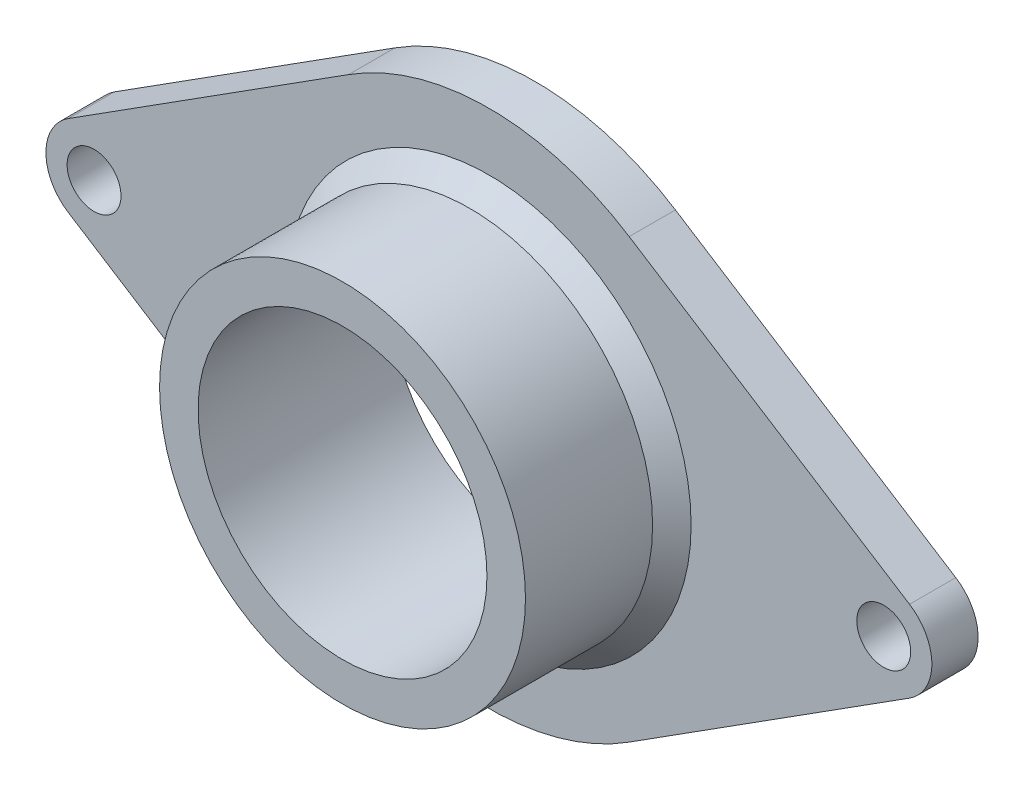
ISO-10303-21;
HEADER;
FILE_DESCRIPTION(('STEP AP214'),'2;1');
FILE_NAME('part.step','',(''),(''),'','','');
FILE_SCHEMA(('AUTOMOTIVE_DESIGN { 1 0 10303 214 1 1 1 1 }'));
ENDSEC;
DATA;
#1=APPLICATION_CONTEXT('core data for automotive mechanical design processes');
#2=APPLICATION_PROTOCOL_DEFINITION('international standard','automotive_design',2000,#1);
#3=PRODUCT_CONTEXT('',#1,'mechanical');
#4=PRODUCT('Part','Part','',(#3));
#5=PRODUCT_RELATED_PRODUCT_CATEGORY('part','',(#4));
#6=PRODUCT_DEFINITION_FORMATION('','',#4);
#7=PRODUCT_DEFINITION_CONTEXT('part definition',#1,'design');
#8=PRODUCT_DEFINITION('design','',#6,#7);
#9=PRODUCT_DEFINITION_SHAPE('','',#8);
#10=(LENGTH_UNIT() NAMED_UNIT(*) SI_UNIT(.MILLI.,.METRE.));
#11=(NAMED_UNIT(*) PLANE_ANGLE_UNIT() SI_UNIT($,.RADIAN.));
#12=(NAMED_UNIT(*) SI_UNIT($,.STERADIAN.) SOLID_ANGLE_UNIT());
#13=UNCERTAINTY_MEASURE_WITH_UNIT(LENGTH_MEASURE(1.E-05),#10,'distance_accuracy_value','');
#14=(GEOMETRIC_REPRESENTATION_CONTEXT(3) GLOBAL_UNCERTAINTY_ASSIGNED_CONTEXT((#13)) GLOBAL_UNIT_ASSIGNED_CONTEXT((#10,
#11,#12)) REPRESENTATION_CONTEXT('',''));
#15=CARTESIAN_POINT('',(0.,0.,0.));
#16=DIRECTION('',(0.,0.,1.));
#17=DIRECTION('',(1.,0.,0.));
#18=AXIS2_PLACEMENT_3D('',#15,#16,#17);
#19=CARTESIAN_POINT('',(0.,0.,50.));
#20=DIRECTION('',(0.,0.,-1.));
#21=DIRECTION('',(-1.,0.,0.));
#22=AXIS2_PLACEMENT_3D('',#19,#20,#21);
#23=CYLINDRICAL_SURFACE('',#22,47.5);
#24=CARTESIAN_POINT('',(0.,0.,17.));
#25=DIRECTION('',(0.,0.,-1.));
#26=DIRECTION('',(-1.,0.,0.));
#27=AXIS2_PLACEMENT_3D('',#24,#25,#26);
#28=CIRCLE('',#27,47.5);
#29=CARTESIAN_POINT('',(-47.5,0.,17.));
#30=VERTEX_POINT('',#29);
#31=EDGE_CURVE('E11',#30,#30,#28,.F.);
#32=ORIENTED_EDGE('',*,*,#31,.T.);
#33=EDGE_LOOP('',(#32));
#34=FACE_BOUND('',#33,.T.);
#35=CARTESIAN_POINT('',(0.,0.,50.));
#36=DIRECTION('',(0.,0.,1.));
#37=DIRECTION('',(1.,0.,0.));
#38=AXIS2_PLACEMENT_3D('',#35,#36,#37);
#39=CIRCLE('',#38,47.5);
#40=CARTESIAN_POINT('',(47.5,0.,50.));
#41=VERTEX_POINT('',#40);
#42=EDGE_CURVE('E170',#41,#41,#39,.T.);
#43=ORIENTED_EDGE('',*,*,#42,.F.);
#44=EDGE_LOOP('',(#43));
#45=FACE_BOUND('',#44,.T.);
#46=ADVANCED_FACE('F33',(#34,#45),#23,.T.);
#47=CARTESIAN_POINT('',(0.,0.,50.));
#48=DIRECTION('',(0.,0.,1.));
#49=DIRECTION('',(1.,0.,0.));
#50=AXIS2_PLACEMENT_3D('',#47,#48,#49);
#51=PLANE('',#50);
#52=ORIENTED_EDGE('',*,*,#42,.T.);
#53=EDGE_LOOP('',(#52));
#54=FACE_BOUND('',#53,.T.);
#55=CARTESIAN_POINT('',(0.,0.,50.));
#56=DIRECTION('',(0.,0.,1.));
#57=DIRECTION('',(1.,0.,0.));
#58=AXIS2_PLACEMENT_3D('',#55,#56,#57);
#59=CIRCLE('',#58,37.5);
#60=CARTESIAN_POINT('',(37.5,0.,50.));
#61=VERTEX_POINT('',#60);
#62=EDGE_CURVE('E167',#61,#61,#59,.T.);
#63=ORIENTED_EDGE('',*,*,#62,.F.);
#64=EDGE_LOOP('',(#63));
#65=FACE_BOUND('',#64,.T.);
#66=ADVANCED_FACE('F197',(#54,#65),#51,.T.);
#67=CARTESIAN_POINT('',(0.,0.,0.));
#68=DIRECTION('',(0.,0.,1.));
#69=DIRECTION('',(1.,0.,0.));
#70=AXIS2_PLACEMENT_3D('',#67,#68,#69);
#71=PLANE('',#70);
#72=CARTESIAN_POINT('',(-102.500000000016,2.47857290247566E-11,0.));
#73=DIRECTION('',(0.,0.,1.));
#74=DIRECTION('',(1.,0.,0.));
#75=AXIS2_PLACEMENT_3D('',#72,#73,#74);
#76=CIRCLE('',#75,7.);
#77=CARTESIAN_POINT('',(-95.5000000000158,2.47857290247566E-11,0.));
#78=VERTEX_POINT('',#77);
#79=EDGE_CURVE('E137',#78,#78,#76,.T.);
#80=ORIENTED_EDGE('',*,*,#79,.T.);
#81=EDGE_LOOP('',(#80));
#82=FACE_BOUND('',#81,.T.);
#83=CARTESIAN_POINT('',(102.500000000016,-2.47718512369488E-11,0.));
#84=DIRECTION('',(0.,0.,1.));
#85=DIRECTION('',(1.,0.,0.));
#86=AXIS2_PLACEMENT_3D('',#83,#84,#85);
#87=CIRCLE('',#86,7.);
#88=CARTESIAN_POINT('',(109.500000000016,-2.47718512369488E-11,0.));
#89=VERTEX_POINT('',#88);
#90=EDGE_CURVE('E178',#89,#89,#87,.T.);
#91=ORIENTED_EDGE('',*,*,#90,.T.);
#92=EDGE_LOOP('',(#91));
#93=FACE_BOUND('',#92,.T.);
#94=CARTESIAN_POINT('',(0.,0.,0.));
#95=DIRECTION('',(0.,0.,1.));
#96=DIRECTION('',(1.,0.,0.));
#97=AXIS2_PLACEMENT_3D('',#94,#95,#96);
#98=CIRCLE('',#97,37.5);
#99=CARTESIAN_POINT('',(37.5,0.,0.));
#100=VERTEX_POINT('',#99);
#101=EDGE_CURVE('E157',#100,#100,#98,.T.);
#102=ORIENTED_EDGE('',*,*,#101,.T.);
#103=EDGE_LOOP('',(#102));
#104=FACE_BOUND('',#103,.T.);
#105=CARTESIAN_POINT('',(0.,0.,0.));
#106=DIRECTION('',(0.,0.,-1.));
#107=DIRECTION('',(-1.,0.,0.));
#108=AXIS2_PLACEMENT_3D('',#105,#106,#107);
#109=CIRCLE('',#108,67.5);
#110=CARTESIAN_POINT('',(36.4250879518292,-56.8283641124879,0.));
#111=VERTEX_POINT('',#110);
#112=CARTESIAN_POINT('',(-36.4250879518293,-56.8283641124879,0.));
#113=VERTEX_POINT('',#112);
#114=EDGE_CURVE('E133',#111,#113,#109,.T.);
#115=ORIENTED_EDGE('',*,*,#114,.T.);
#116=DIRECTION('',(-0.843848784833768,0.536581054766727,0.));
#117=VECTOR('',#116,1.);
#118=CARTESIAN_POINT('',(-36.4250879518293,-56.8283641124879,0.));
#119=LINE('',#118,#117);
#120=CARTESIAN_POINT('',(-109.207263184572,-10.5481098104148,0.));
#121=VERTEX_POINT('',#120);
#122=EDGE_CURVE('E136',#113,#121,#119,.T.);
#123=ORIENTED_EDGE('',*,*,#122,.T.);
#124=CARTESIAN_POINT('',(-102.500000000016,2.47857290247566E-11,0.));
#125=DIRECTION('',(0.,0.,-1.));
#126=DIRECTION('',(-1.,0.,0.));
#127=AXIS2_PLACEMENT_3D('',#124,#125,#126);
#128=CIRCLE('',#127,12.5);
#129=CARTESIAN_POINT('',(-109.207263184595,10.5481098104501,0.));
#130=VERTEX_POINT('',#129);
#131=EDGE_CURVE('E140',#121,#130,#128,.T.);
#132=ORIENTED_EDGE('',*,*,#131,.T.);
#133=DIRECTION('',(0.843848784834028,0.536581054766318,0.));
#134=VECTOR('',#133,1.);
#135=CARTESIAN_POINT('',(-36.4250879518292,56.828364112488,0.));
#136=LINE('',#135,#134);
#137=CARTESIAN_POINT('',(-36.4250879518292,56.828364112488,0.));
#138=VERTEX_POINT('',#137);
#139=EDGE_CURVE('E143',#130,#138,#136,.T.);
#140=ORIENTED_EDGE('',*,*,#139,.T.);
#141=CARTESIAN_POINT('',(0.,0.,0.));
#142=DIRECTION('',(0.,0.,-1.));
#143=DIRECTION('',(-1.,0.,0.));
#144=AXIS2_PLACEMENT_3D('',#141,#142,#143);
#145=CIRCLE('',#144,67.5);
#146=CARTESIAN_POINT('',(36.4250879518517,56.8283641124735,0.));
#147=VERTEX_POINT('',#146);
#148=EDGE_CURVE('E146',#138,#147,#145,.T.);
#149=ORIENTED_EDGE('',*,*,#148,.T.);
#150=DIRECTION('',(0.843848784833768,-0.536581054766727,0.));
#151=VECTOR('',#150,1.);
#152=CARTESIAN_POINT('',(36.4250879518517,56.8283641124735,0.));
#153=LINE('',#152,#151);
#154=CARTESIAN_POINT('',(109.207263184595,10.5481098104005,0.));
#155=VERTEX_POINT('',#154);
#156=EDGE_CURVE('E149',#147,#155,#153,.T.);
#157=ORIENTED_EDGE('',*,*,#156,.T.);
#158=CARTESIAN_POINT('',(102.500000000016,-2.47718512369488E-11,0.));
#159=DIRECTION('',(0.,0.,-1.));
#160=DIRECTION('',(-1.,0.,0.));
#161=AXIS2_PLACEMENT_3D('',#158,#159,#160);
#162=CIRCLE('',#161,12.5);
#163=CARTESIAN_POINT('',(109.207263184595,-10.5481098104501,0.));
#164=VERTEX_POINT('',#163);
#165=EDGE_CURVE('E110',#155,#164,#162,.T.);
#166=ORIENTED_EDGE('',*,*,#165,.T.);
#167=DIRECTION('',(-0.843848784834027,-0.536581054766319,0.));
#168=VECTOR('',#167,1.);
#169=CARTESIAN_POINT('',(36.4250879518292,-56.8283641124879,0.));
#170=LINE('',#169,#168);
#171=EDGE_CURVE('E152',#164,#111,#170,.T.);
#172=ORIENTED_EDGE('',*,*,#171,.T.);
#173=EDGE_LOOP('',(#115,#123,#132,#140,#149,#157,#166,#172));
#174=FACE_BOUND('',#173,.T.);
#175=ADVANCED_FACE('F204',(#82,#93,#104,#174),#71,.F.);
#176=CARTESIAN_POINT('',(0.,0.,50.));
#177=DIRECTION('',(0.,0.,-1.));
#178=DIRECTION('',(-1.,0.,0.));
#179=AXIS2_PLACEMENT_3D('',#176,#177,#178);
#180=CYLINDRICAL_SURFACE('',#179,37.5);
#181=ORIENTED_EDGE('',*,*,#62,.T.);
#182=EDGE_LOOP('',(#181));
#183=FACE_BOUND('',#182,.T.);
#184=ORIENTED_EDGE('',*,*,#101,.F.);
#185=EDGE_LOOP('',(#184));
#186=FACE_BOUND('',#185,.T.);
#187=ADVANCED_FACE('F210',(#183,#186),#180,.F.);
#188=CARTESIAN_POINT('',(0.,0.,12.));
#189=DIRECTION('',(0.,0.,-1.));
#190=DIRECTION('',(-1.,0.,0.));
#191=AXIS2_PLACEMENT_3D('',#188,#189,#190);
#192=CYLINDRICAL_SURFACE('',#191,67.5);
#193=ORIENTED_EDGE('',*,*,#114,.F.);
#194=DIRECTION('',(0.,0.,-1.));
#195=VECTOR('',#194,1.);
#196=CARTESIAN_POINT('',(36.4250879518292,-56.8283641124879,12.));
#197=LINE('',#196,#195);
#198=CARTESIAN_POINT('',(36.4250879518292,-56.8283641124879,12.));
#199=VERTEX_POINT('',#198);
#200=EDGE_CURVE('E50',#199,#111,#197,.T.);
#201=ORIENTED_EDGE('',*,*,#200,.F.);
#202=CARTESIAN_POINT('',(0.,0.,12.));
#203=DIRECTION('',(0.,0.,-1.));
#204=DIRECTION('',(-1.,0.,0.));
#205=AXIS2_PLACEMENT_3D('',#202,#203,#204);
#206=CIRCLE('',#205,67.5);
#207=CARTESIAN_POINT('',(-36.4250879518293,-56.8283641124879,12.));
#208=VERTEX_POINT('',#207);
#209=EDGE_CURVE('E155',#199,#208,#206,.T.);
#210=ORIENTED_EDGE('',*,*,#209,.T.);
#211=DIRECTION('',(0.,0.,-1.));
#212=VECTOR('',#211,1.);
#213=CARTESIAN_POINT('',(-36.4250879518293,-56.8283641124879,12.));
#214=LINE('',#213,#212);
#215=EDGE_CURVE('E91',#208,#113,#214,.T.);
#216=ORIENTED_EDGE('',*,*,#215,.T.);
#217=EDGE_LOOP('',(#193,#201,#210,#216));
#218=FACE_BOUND('',#217,.T.);
#219=ADVANCED_FACE('F215',(#218),#192,.T.);
#220=CARTESIAN_POINT('',(36.4250879518292,-56.8283641124879,12.));
#221=DIRECTION('',(0.536581054766319,-0.843848784834027,0.));
#222=DIRECTION('',(0.843848784834028,0.536581054766319,0.));
#223=AXIS2_PLACEMENT_3D('',#220,#221,#222);
#224=PLANE('',#223);
#225=ORIENTED_EDGE('',*,*,#171,.F.);
#226=DIRECTION('',(0.,0.,-1.));
#227=VECTOR('',#226,1.);
#228=CARTESIAN_POINT('',(109.207263184595,-10.5481098104501,12.));
#229=LINE('',#228,#227);
#230=CARTESIAN_POINT('',(109.207263184595,-10.5481098104501,12.));
#231=VERTEX_POINT('',#230);
#232=EDGE_CURVE('E79',#231,#164,#229,.T.);
#233=ORIENTED_EDGE('',*,*,#232,.F.);
#234=DIRECTION('',(-0.843848784834027,-0.536581054766319,0.));
#235=VECTOR('',#234,1.);
#236=CARTESIAN_POINT('',(36.4250879518292,-56.8283641124879,12.));
#237=LINE('',#236,#235);
#238=EDGE_CURVE('E123',#231,#199,#237,.T.);
#239=ORIENTED_EDGE('',*,*,#238,.T.);
#240=ORIENTED_EDGE('',*,*,#200,.T.);
#241=EDGE_LOOP('',(#225,#233,#239,#240));
#242=FACE_BOUND('',#241,.T.);
#243=ADVANCED_FACE('F219',(#242),#224,.T.);
#244=CARTESIAN_POINT('',(102.500000000016,-2.47718512369488E-11,12.));
#245=DIRECTION('',(0.,0.,-1.));
#246=DIRECTION('',(-1.,0.,0.));
#247=AXIS2_PLACEMENT_3D('',#244,#245,#246);
#248=CYLINDRICAL_SURFACE('',#247,12.5);
#249=ORIENTED_EDGE('',*,*,#165,.F.);
#250=DIRECTION('',(0.,0.,-1.));
#251=VECTOR('',#250,1.);
#252=CARTESIAN_POINT('',(109.207263184595,10.5481098104005,12.));
#253=LINE('',#252,#251);
#254=CARTESIAN_POINT('',(109.207263184595,10.5481098104005,12.));
#255=VERTEX_POINT('',#254);
#256=EDGE_CURVE('E105',#255,#155,#253,.T.);
#257=ORIENTED_EDGE('',*,*,#256,.F.);
#258=CARTESIAN_POINT('',(102.500000000016,-2.47718512369488E-11,12.));
#259=DIRECTION('',(0.,0.,-1.));
#260=DIRECTION('',(-1.,0.,0.));
#261=AXIS2_PLACEMENT_3D('',#258,#259,#260);
#262=CIRCLE('',#261,12.5);
#263=EDGE_CURVE('E108',#255,#231,#262,.T.);
#264=ORIENTED_EDGE('',*,*,#263,.T.);
#265=ORIENTED_EDGE('',*,*,#232,.T.);
#266=EDGE_LOOP('',(#249,#257,#264,#265));
#267=FACE_BOUND('',#266,.T.);
#268=ADVANCED_FACE('F107',(#267),#248,.T.);
#269=CARTESIAN_POINT('',(36.4250879518517,56.8283641124735,12.));
#270=DIRECTION('',(0.536581054766727,0.843848784833768,0.));
#271=DIRECTION('',(-0.843848784833768,0.536581054766727,0.));
#272=AXIS2_PLACEMENT_3D('',#269,#270,#271);
#273=PLANE('',#272);
#274=ORIENTED_EDGE('',*,*,#156,.F.);
#275=DIRECTION('',(0.,0.,-1.));
#276=VECTOR('',#275,1.);
#277=CARTESIAN_POINT('',(36.4250879518517,56.8283641124735,12.));
#278=LINE('',#277,#276);
#279=CARTESIAN_POINT('',(36.4250879518517,56.8283641124735,12.));
#280=VERTEX_POINT('',#279);
#281=EDGE_CURVE('E115',#280,#147,#278,.T.);
#282=ORIENTED_EDGE('',*,*,#281,.F.);
#283=DIRECTION('',(0.843848784833768,-0.536581054766727,0.));
#284=VECTOR('',#283,1.);
#285=CARTESIAN_POINT('',(36.4250879518517,56.8283641124735,12.));
#286=LINE('',#285,#284);
#287=EDGE_CURVE('E121',#280,#255,#286,.T.);
#288=ORIENTED_EDGE('',*,*,#287,.T.);
#289=ORIENTED_EDGE('',*,*,#256,.T.);
#290=EDGE_LOOP('',(#274,#282,#288,#289));
#291=FACE_BOUND('',#290,.T.);
#292=ADVANCED_FACE('F125',(#291),#273,.T.);
#293=CARTESIAN_POINT('',(0.,0.,12.));
#294=DIRECTION('',(0.,0.,-1.));
#295=DIRECTION('',(-1.,0.,0.));
#296=AXIS2_PLACEMENT_3D('',#293,#294,#295);
#297=CYLINDRICAL_SURFACE('',#296,67.5);
#298=ORIENTED_EDGE('',*,*,#148,.F.);
#299=DIRECTION('',(0.,0.,-1.));
#300=VECTOR('',#299,1.);
#301=CARTESIAN_POINT('',(-36.4250879518292,56.828364112488,12.));
#302=LINE('',#301,#300);
#303=CARTESIAN_POINT('',(-36.4250879518292,56.828364112488,12.));
#304=VERTEX_POINT('',#303);
#305=EDGE_CURVE('E160',#304,#138,#302,.T.);
#306=ORIENTED_EDGE('',*,*,#305,.F.);
#307=CARTESIAN_POINT('',(0.,0.,12.));
#308=DIRECTION('',(0.,0.,-1.));
#309=DIRECTION('',(-1.,0.,0.));
#310=AXIS2_PLACEMENT_3D('',#307,#308,#309);
#311=CIRCLE('',#310,67.5);
#312=EDGE_CURVE('E126',#304,#280,#311,.T.);
#313=ORIENTED_EDGE('',*,*,#312,.T.);
#314=ORIENTED_EDGE('',*,*,#281,.T.);
#315=EDGE_LOOP('',(#298,#306,#313,#314));
#316=FACE_BOUND('',#315,.T.);
#317=ADVANCED_FACE('F230',(#316),#297,.T.);
#318=CARTESIAN_POINT('',(-36.4250879518292,56.828364112488,12.));
#319=DIRECTION('',(-0.536581054766318,0.843848784834028,0.));
#320=DIRECTION('',(-0.843848784834028,-0.536581054766319,0.));
#321=AXIS2_PLACEMENT_3D('',#318,#319,#320);
#322=PLANE('',#321);
#323=ORIENTED_EDGE('',*,*,#139,.F.);
#324=DIRECTION('',(0.,0.,-1.));
#325=VECTOR('',#324,1.);
#326=CARTESIAN_POINT('',(-109.207263184595,10.5481098104501,12.));
#327=LINE('',#326,#325);
#328=CARTESIAN_POINT('',(-109.207263184595,10.5481098104501,12.));
#329=VERTEX_POINT('',#328);
#330=EDGE_CURVE('E162',#329,#130,#327,.T.);
#331=ORIENTED_EDGE('',*,*,#330,.F.);
#332=DIRECTION('',(0.843848784834028,0.536581054766318,0.));
#333=VECTOR('',#332,1.);
#334=CARTESIAN_POINT('',(-36.4250879518292,56.828364112488,12.));
#335=LINE('',#334,#333);
#336=EDGE_CURVE('E128',#329,#304,#335,.T.);
#337=ORIENTED_EDGE('',*,*,#336,.T.);
#338=ORIENTED_EDGE('',*,*,#305,.T.);
#339=EDGE_LOOP('',(#323,#331,#337,#338));
#340=FACE_BOUND('',#339,.T.);
#341=ADVANCED_FACE('F226',(#340),#322,.T.);
#342=CARTESIAN_POINT('',(-102.500000000016,2.47857290247566E-11,12.));
#343=DIRECTION('',(0.,0.,-1.));
#344=DIRECTION('',(-1.,0.,0.));
#345=AXIS2_PLACEMENT_3D('',#342,#343,#344);
#346=CYLINDRICAL_SURFACE('',#345,12.5);
#347=ORIENTED_EDGE('',*,*,#131,.F.);
#348=DIRECTION('',(0.,0.,-1.));
#349=VECTOR('',#348,1.);
#350=CARTESIAN_POINT('',(-109.207263184572,-10.5481098104148,12.));
#351=LINE('',#350,#349);
#352=CARTESIAN_POINT('',(-109.207263184572,-10.5481098104148,12.));
#353=VERTEX_POINT('',#352);
#354=EDGE_CURVE('E164',#353,#121,#351,.T.);
#355=ORIENTED_EDGE('',*,*,#354,.F.);
#356=CARTESIAN_POINT('',(-102.500000000016,2.47857290247566E-11,12.));
#357=DIRECTION('',(0.,0.,-1.));
#358=DIRECTION('',(-1.,0.,0.));
#359=AXIS2_PLACEMENT_3D('',#356,#357,#358);
#360=CIRCLE('',#359,12.5);
#361=EDGE_CURVE('E259',#353,#329,#360,.T.);
#362=ORIENTED_EDGE('',*,*,#361,.T.);
#363=ORIENTED_EDGE('',*,*,#330,.T.);
#364=EDGE_LOOP('',(#347,#355,#362,#363));
#365=FACE_BOUND('',#364,.T.);
#366=ADVANCED_FACE('F223',(#365),#346,.T.);
#367=CARTESIAN_POINT('',(-36.4250879518293,-56.8283641124879,12.));
#368=DIRECTION('',(-0.536581054766727,-0.843848784833768,0.));
#369=DIRECTION('',(0.843848784833768,-0.536581054766727,0.));
#370=AXIS2_PLACEMENT_3D('',#367,#368,#369);
#371=PLANE('',#370);
#372=ORIENTED_EDGE('',*,*,#122,.F.);
#373=ORIENTED_EDGE('',*,*,#215,.F.);
#374=DIRECTION('',(-0.843848784833768,0.536581054766727,0.));
#375=VECTOR('',#374,1.);
#376=CARTESIAN_POINT('',(-36.4250879518293,-56.8283641124879,12.));
#377=LINE('',#376,#375);
#378=EDGE_CURVE('E257',#208,#353,#377,.T.);
#379=ORIENTED_EDGE('',*,*,#378,.T.);
#380=ORIENTED_EDGE('',*,*,#354,.T.);
#381=EDGE_LOOP('',(#372,#373,#379,#380));
#382=FACE_BOUND('',#381,.T.);
#383=ADVANCED_FACE('F220',(#382),#371,.T.);
#384=CARTESIAN_POINT('',(0.,0.,12.));
#385=DIRECTION('',(0.,0.,-1.));
#386=DIRECTION('',(-1.,0.,0.));
#387=AXIS2_PLACEMENT_3D('',#384,#385,#386);
#388=PLANE('',#387);
#389=CARTESIAN_POINT('',(0.,0.,12.));
#390=DIRECTION('',(0.,0.,-1.));
#391=DIRECTION('',(-1.,0.,0.));
#392=AXIS2_PLACEMENT_3D('',#389,#390,#391);
#393=CIRCLE('',#392,52.5000000000001);
#394=CARTESIAN_POINT('',(-52.5000000000001,0.,12.));
#395=VERTEX_POINT('',#394);
#396=EDGE_CURVE('E42',#395,#395,#393,.T.);
#397=ORIENTED_EDGE('',*,*,#396,.T.);
#398=EDGE_LOOP('',(#397));
#399=FACE_BOUND('',#398,.T.);
#400=CARTESIAN_POINT('',(-102.500000000016,2.47857290247566E-11,12.));
#401=DIRECTION('',(0.,0.,-1.));
#402=DIRECTION('',(-1.,0.,0.));
#403=AXIS2_PLACEMENT_3D('',#400,#401,#402);
#404=CIRCLE('',#403,7.);
#405=CARTESIAN_POINT('',(-109.500000000016,2.47857290247566E-11,12.));
#406=VERTEX_POINT('',#405);
#407=EDGE_CURVE('E179',#406,#406,#404,.T.);
#408=ORIENTED_EDGE('',*,*,#407,.T.);
#409=EDGE_LOOP('',(#408));
#410=FACE_BOUND('',#409,.T.);
#411=CARTESIAN_POINT('',(102.500000000016,-2.47718512369488E-11,12.));
#412=DIRECTION('',(0.,0.,-1.));
#413=DIRECTION('',(-1.,0.,0.));
#414=AXIS2_PLACEMENT_3D('',#411,#412,#413);
#415=CIRCLE('',#414,7.);
#416=CARTESIAN_POINT('',(95.5000000000158,-2.47718512369488E-11,12.));
#417=VERTEX_POINT('',#416);
#418=EDGE_CURVE('E175',#417,#417,#415,.T.);
#419=ORIENTED_EDGE('',*,*,#418,.T.);
#420=EDGE_LOOP('',(#419));
#421=FACE_BOUND('',#420,.T.);
#422=ORIENTED_EDGE('',*,*,#209,.F.);
#423=ORIENTED_EDGE('',*,*,#238,.F.);
#424=ORIENTED_EDGE('',*,*,#263,.F.);
#425=ORIENTED_EDGE('',*,*,#287,.F.);
#426=ORIENTED_EDGE('',*,*,#312,.F.);
#427=ORIENTED_EDGE('',*,*,#336,.F.);
#428=ORIENTED_EDGE('',*,*,#361,.F.);
#429=ORIENTED_EDGE('',*,*,#378,.F.);
#430=EDGE_LOOP('',(#422,#423,#424,#425,#426,#427,#428,#429));
#431=FACE_BOUND('',#430,.T.);
#432=ADVANCED_FACE('F119',(#399,#410,#421,#431),#388,.F.);
#433=CARTESIAN_POINT('',(102.500000000016,-2.47718512369488E-11,50.));
#434=DIRECTION('',(0.,0.,-1.));
#435=DIRECTION('',(-1.,0.,0.));
#436=AXIS2_PLACEMENT_3D('',#433,#434,#435);
#437=CYLINDRICAL_SURFACE('',#436,7.);
#438=ORIENTED_EDGE('',*,*,#418,.F.);
#439=EDGE_LOOP('',(#438));
#440=FACE_BOUND('',#439,.T.);
#441=ORIENTED_EDGE('',*,*,#90,.F.);
#442=EDGE_LOOP('',(#441));
#443=FACE_BOUND('',#442,.T.);
#444=ADVANCED_FACE('F192',(#440,#443),#437,.F.);
#445=CARTESIAN_POINT('',(-102.500000000016,2.47857290247566E-11,50.));
#446=DIRECTION('',(0.,0.,-1.));
#447=DIRECTION('',(-1.,0.,0.));
#448=AXIS2_PLACEMENT_3D('',#445,#446,#447);
#449=CYLINDRICAL_SURFACE('',#448,7.);
#450=ORIENTED_EDGE('',*,*,#407,.F.);
#451=EDGE_LOOP('',(#450));
#452=FACE_BOUND('',#451,.T.);
#453=ORIENTED_EDGE('',*,*,#79,.F.);
#454=EDGE_LOOP('',(#453));
#455=FACE_BOUND('',#454,.T.);
#456=ADVANCED_FACE('F187',(#452,#455),#449,.F.);
#457=CARTESIAN_POINT('',(0.,0.,12.));
#458=DIRECTION('',(0.,0.,-1.));
#459=DIRECTION('',(-1.,0.,0.));
#460=AXIS2_PLACEMENT_3D('',#457,#458,#459);
#461=CONICAL_SURFACE('',#460,52.5000000000001,0.785398163397456);
#462=ORIENTED_EDGE('',*,*,#31,.F.);
#463=EDGE_LOOP('',(#462));
#464=FACE_BOUND('',#463,.T.);
#465=ORIENTED_EDGE('',*,*,#396,.F.);
#466=EDGE_LOOP('',(#465));
#467=FACE_BOUND('',#466,.T.);
#468=ADVANCED_FACE('F35',(#464,#467),#461,.T.);
#469=CLOSED_SHELL('',(#46,#66,#175,#187,#219,#243,#268,#292,#317,#341,#366,#383,#432,#444,#456,#468));
#470=MANIFOLD_SOLID_BREP('B2',#469);
#471=ADVANCED_BREP_SHAPE_REPRESENTATION('',(#18,#470),#14);
#472=SHAPE_DEFINITION_REPRESENTATION(#9,#471);
ENDSEC;
END-ISO-10303-21;
